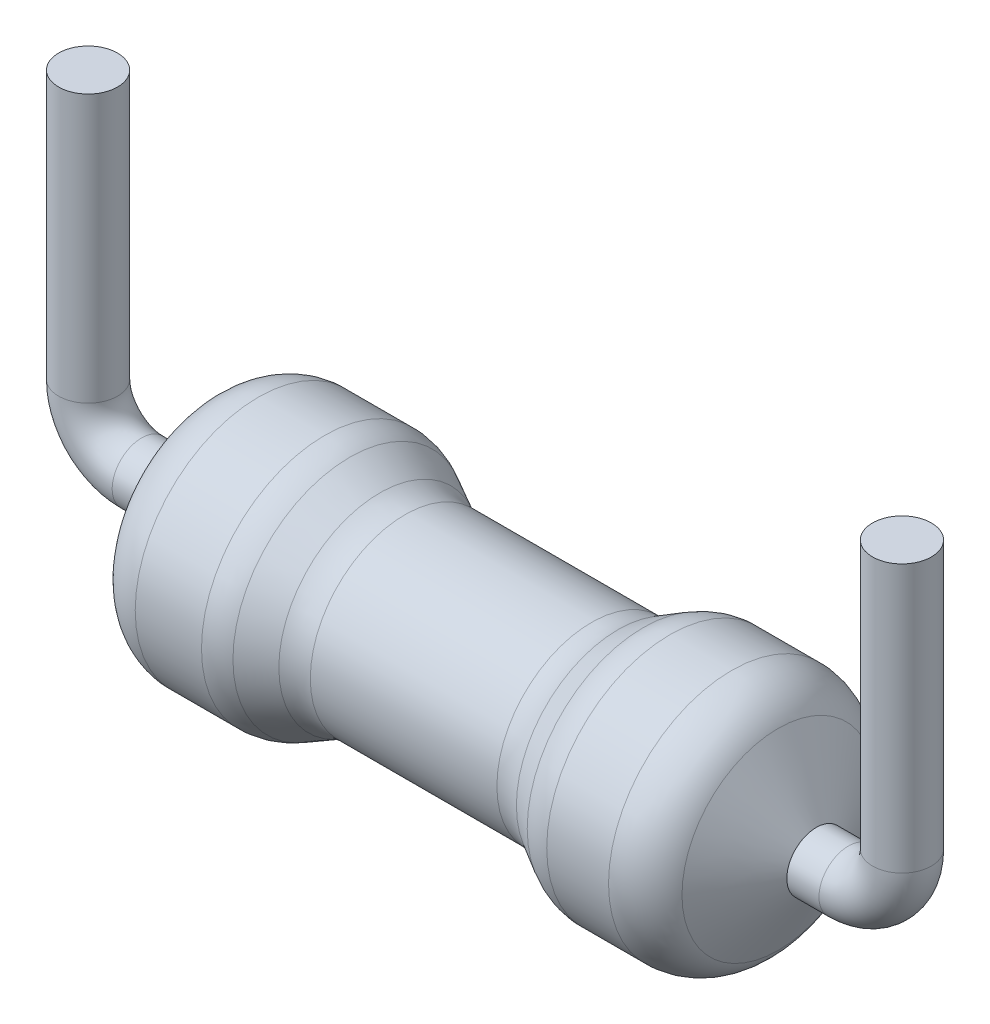
ISO-10303-21;
HEADER;
FILE_DESCRIPTION(('STEP AP214'),'2;1');
FILE_NAME('part.step','',(''),(''),'','','');
FILE_SCHEMA(('AUTOMOTIVE_DESIGN { 1 0 10303 214 1 1 1 1 }'));
ENDSEC;
DATA;
#1=APPLICATION_CONTEXT('core data for automotive mechanical design processes');
#2=APPLICATION_PROTOCOL_DEFINITION('international standard','automotive_design',2000,#1);
#3=PRODUCT_CONTEXT('',#1,'mechanical');
#4=PRODUCT('Part','Part','',(#3));
#5=PRODUCT_RELATED_PRODUCT_CATEGORY('part','',(#4));
#6=PRODUCT_DEFINITION_FORMATION('','',#4);
#7=PRODUCT_DEFINITION_CONTEXT('part definition',#1,'design');
#8=PRODUCT_DEFINITION('design','',#6,#7);
#9=PRODUCT_DEFINITION_SHAPE('','',#8);
#10=(LENGTH_UNIT() NAMED_UNIT(*) SI_UNIT(.MILLI.,.METRE.));
#11=(NAMED_UNIT(*) PLANE_ANGLE_UNIT() SI_UNIT($,.RADIAN.));
#12=(NAMED_UNIT(*) SI_UNIT($,.STERADIAN.) SOLID_ANGLE_UNIT());
#13=UNCERTAINTY_MEASURE_WITH_UNIT(LENGTH_MEASURE(1.E-05),#10,'distance_accuracy_value','');
#14=(GEOMETRIC_REPRESENTATION_CONTEXT(3) GLOBAL_UNCERTAINTY_ASSIGNED_CONTEXT((#13)) GLOBAL_UNIT_ASSIGNED_CONTEXT((#10,
#11,#12)) REPRESENTATION_CONTEXT('',''));
#15=CARTESIAN_POINT('',(0.,0.,0.));
#16=DIRECTION('',(0.,0.,1.));
#17=DIRECTION('',(1.,0.,0.));
#18=AXIS2_PLACEMENT_3D('',#15,#16,#17);
#19=CARTESIAN_POINT('',(3.,0.,0.));
#20=DIRECTION('',(-1.,0.,0.));
#21=DIRECTION('',(0.,0.,1.));
#22=AXIS2_PLACEMENT_3D('',#19,#20,#21);
#23=CONICAL_SURFACE('',#22,0.275,1.05165021254837);
#24=CARTESIAN_POINT('',(2.64396030332662,0.,0.));
#25=DIRECTION('',(1.,0.,0.));
#26=DIRECTION('',(0.,0.,-1.));
#27=AXIS2_PLACEMENT_3D('',#24,#25,#26);
#28=CIRCLE('',#27,0.898069469178417);
#29=CARTESIAN_POINT('',(2.64396030332662,0.,0.898069469178417));
#30=VERTEX_POINT('',#29);
#31=EDGE_CURVE('E11',#30,#30,#28,.T.);
#32=CARTESIAN_POINT('',(3.,0.,0.));
#33=DIRECTION('',(-1.,0.,0.));
#34=DIRECTION('',(0.,0.,1.));
#35=AXIS2_PLACEMENT_3D('',#32,#33,#34);
#36=CIRCLE('',#35,0.275);
#37=CARTESIAN_POINT('',(3.,0.,0.275));
#38=VERTEX_POINT('',#37);
#39=EDGE_CURVE('E61',#38,#38,#36,.T.);
#40=CARTESIAN_POINT('',(2.64396030332662,0.,0.898069469178417));
#41=CARTESIAN_POINT('',(2.64766905016697,0.,0.891579162207808));
#42=CARTESIAN_POINT('',(2.65137779700731,0.,0.8850888552372));
#43=CARTESIAN_POINT('',(2.65879529068801,0.,0.872108241295983));
#44=CARTESIAN_POINT('',(2.66250403752836,0.,0.865617934325374));
#45=CARTESIAN_POINT('',(2.66992153120905,0.,0.852637320384157));
#46=CARTESIAN_POINT('',(2.6736302780494,0.,0.846147013413549));
#47=CARTESIAN_POINT('',(2.6810477717301,0.,0.833166399472332));
#48=CARTESIAN_POINT('',(2.68475651857044,0.,0.826676092501723));
#49=CARTESIAN_POINT('',(2.69217401225114,0.,0.813695478560506));
#50=CARTESIAN_POINT('',(2.69588275909149,0.,0.807205171589898));
#51=CARTESIAN_POINT('',(2.70330025277218,0.,0.794224557648681));
#52=CARTESIAN_POINT('',(2.70700899961253,0.,0.787734250678072));
#53=CARTESIAN_POINT('',(2.71442649329323,0.,0.774753636736855));
#54=CARTESIAN_POINT('',(2.71813524013357,0.,0.768263329766247));
#55=CARTESIAN_POINT('',(2.72555273381427,0.,0.75528271582503));
#56=CARTESIAN_POINT('',(2.72926148065462,0.,0.748792408854421));
#57=CARTESIAN_POINT('',(2.73667897433531,0.,0.735811794913204));
#58=CARTESIAN_POINT('',(2.74038772117566,0.,0.729321487942596));
#59=CARTESIAN_POINT('',(2.74780521485635,0.,0.716340874001378));
#60=CARTESIAN_POINT('',(2.7515139616967,0.,0.70985056703077));
#61=CARTESIAN_POINT('',(2.7589314553774,0.,0.696869953089553));
#62=CARTESIAN_POINT('',(2.76264020221775,0.,0.690379646118944));
#63=CARTESIAN_POINT('',(2.77005769589844,0.,0.677399032177727));
#64=CARTESIAN_POINT('',(2.77376644273879,0.,0.670908725207119));
#65=CARTESIAN_POINT('',(2.78118393641948,0.,0.657928111265902));
#66=CARTESIAN_POINT('',(2.78489268325983,0.,0.651437804295293));
#67=CARTESIAN_POINT('',(2.79231017694053,0.,0.638457190354076));
#68=CARTESIAN_POINT('',(2.79601892378088,0.,0.631966883383468));
#69=CARTESIAN_POINT('',(2.80343641746157,0.,0.618986269442251));
#70=CARTESIAN_POINT('',(2.80714516430192,0.,0.612495962471642));
#71=CARTESIAN_POINT('',(2.81456265798261,0.,0.599515348530425));
#72=CARTESIAN_POINT('',(2.81827140482296,0.,0.593025041559817));
#73=CARTESIAN_POINT('',(2.82568889850366,0.,0.5800444276186));
#74=CARTESIAN_POINT('',(2.82939764534401,0.,0.573554120647991));
#75=CARTESIAN_POINT('',(2.8368151390247,0.,0.560573506706774));
#76=CARTESIAN_POINT('',(2.84052388586505,0.,0.554083199736166));
#77=CARTESIAN_POINT('',(2.84794137954574,0.,0.541102585794949));
#78=CARTESIAN_POINT('',(2.85165012638609,0.,0.53461227882434));
#79=CARTESIAN_POINT('',(2.85906762006679,0.,0.521631664883123));
#80=CARTESIAN_POINT('',(2.86277636690713,0.,0.515141357912515));
#81=CARTESIAN_POINT('',(2.87019386058783,0.,0.502160743971298));
#82=CARTESIAN_POINT('',(2.87390260742818,0.,0.495670437000689));
#83=CARTESIAN_POINT('',(2.88132010110887,0.,0.482689823059472));
#84=CARTESIAN_POINT('',(2.88502884794922,0.,0.476199516088863));
#85=CARTESIAN_POINT('',(2.89244634162992,0.,0.463218902147646));
#86=CARTESIAN_POINT('',(2.89615508847026,0.,0.456728595177038));
#87=CARTESIAN_POINT('',(2.90357258215096,0.,0.443747981235821));
#88=CARTESIAN_POINT('',(2.90728132899131,0.,0.437257674265212));
#89=CARTESIAN_POINT('',(2.914698822672,0.,0.424277060323995));
#90=CARTESIAN_POINT('',(2.91840756951235,0.,0.417786753353387));
#91=CARTESIAN_POINT('',(2.92582506319305,0.,0.40480613941217));
#92=CARTESIAN_POINT('',(2.92953381003339,0.,0.398315832441561));
#93=CARTESIAN_POINT('',(2.93695130371409,0.,0.385335218500344));
#94=CARTESIAN_POINT('',(2.94066005055444,0.,0.378844911529736));
#95=CARTESIAN_POINT('',(2.94807754423513,0.,0.365864297588519));
#96=CARTESIAN_POINT('',(2.95178629107548,0.,0.35937399061791));
#97=CARTESIAN_POINT('',(2.95920378475618,0.,0.346393376676693));
#98=CARTESIAN_POINT('',(2.96291253159652,0.,0.339903069706085));
#99=CARTESIAN_POINT('',(2.97033002527722,0.,0.326922455764868));
#100=CARTESIAN_POINT('',(2.97403877211757,0.,0.320432148794259));
#101=CARTESIAN_POINT('',(2.98145626579826,0.,0.307451534853042));
#102=CARTESIAN_POINT('',(2.98516501263861,0.,0.300961227882434));
#103=CARTESIAN_POINT('',(2.9925825063193,0.,0.287980613941217));
#104=CARTESIAN_POINT('',(2.99629125315965,0.,0.281490306970608));
#105=CARTESIAN_POINT('',(3.,0.,0.275));
#106=B_SPLINE_CURVE_WITH_KNOTS('',3,(#40,#41,#42,#43,#44,#45,#46,#47,#48,#49,#50,#51,#52,#53,
#54,#55,#56,#57,#58,#59,#60,#61,#62,#63,#64,#65,#66,#67,#68,#69,#70,#71,#72,#73,#74,#75,#76,#77,
#78,#79,#80,#81,#82,#83,#84,#85,#86,#87,#88,#89,#90,#91,#92,#93,#94,#95,#96,#97,#98,#99,#100,
#101,#102,#103,#104,#105),.UNSPECIFIED.,.F.,.F.,(4,2,2,2,2,2,2,2,2,2,2,2,2,2,2,2,2,2,2,2,2,2,2,
2,2,2,2,2,2,2,2,2,4),(0.,0.0224256547125532,0.0448513094251064,0.0672769641376601,
0.0897026188502135,0.112128273562767,0.13455392827532,0.156979582987874,0.179405237700427,
0.20183089241298,0.224256547125534,0.246682201838087,0.269107856550641,0.291533511263194,
0.313959165975747,0.336384820688301,0.358810475400854,0.381236130113408,0.403661784825961,
0.426087439538515,0.448513094251068,0.470938748963621,0.493364403676175,0.515790058388728,
0.538215713101281,0.560641367813835,0.583067022526388,0.605492677238942,0.627918331951495,
0.650343986664048,0.672769641376602,0.695195296089155,0.717620950801708),.UNSPECIFIED.);
#107=EDGE_CURVE('BSEAM39',#30,#38,#106,.T.);
#108=ORIENTED_EDGE('',*,*,#31,.T.);
#109=ORIENTED_EDGE('',*,*,#39,.T.);
#110=ORIENTED_EDGE('',*,*,#107,.T.);
#111=ORIENTED_EDGE('',*,*,#107,.F.);
#112=EDGE_LOOP('',(#108,#110,#109,#111));
#113=FACE_BOUND('',#112,.T.);
#114=ADVANCED_FACE('F39',(#113),#23,.T.);
#115=CARTESIAN_POINT('',(0.,0.,0.));
#116=DIRECTION('',(-1.,0.,0.));
#117=DIRECTION('',(0.,0.,1.));
#118=AXIS2_PLACEMENT_3D('',#115,#116,#117);
#119=CYLINDRICAL_SURFACE('',#118,1.15);
#120=CARTESIAN_POINT('',(1.63278221853732,0.,0.));
#121=DIRECTION('',(1.,0.,0.));
#122=DIRECTION('',(0.,0.,-1.));
#123=AXIS2_PLACEMENT_3D('',#120,#121,#122);
#124=CIRCLE('',#123,1.15);
#125=CARTESIAN_POINT('',(1.63278221853732,0.,-1.15));
#126=VERTEX_POINT('',#125);
#127=EDGE_CURVE('E48',#126,#126,#124,.T.);
#128=ORIENTED_EDGE('',*,*,#127,.T.);
#129=EDGE_LOOP('',(#128));
#130=FACE_BOUND('',#129,.T.);
#131=CARTESIAN_POINT('',(2.20983873226439,0.,0.));
#132=DIRECTION('',(1.,0.,0.));
#133=DIRECTION('',(0.,0.,-1.));
#134=AXIS2_PLACEMENT_3D('',#131,#132,#133);
#135=CIRCLE('',#134,1.15);
#136=CARTESIAN_POINT('',(2.20983873226439,0.,-1.15));
#137=VERTEX_POINT('',#136);
#138=EDGE_CURVE('E113',#137,#137,#135,.F.);
#139=ORIENTED_EDGE('',*,*,#138,.T.);
#140=EDGE_LOOP('',(#139));
#141=FACE_BOUND('',#140,.T.);
#142=ADVANCED_FACE('F120',(#130,#141),#119,.T.);
#143=CARTESIAN_POINT('',(1.5,0.,0.));
#144=DIRECTION('',(1.,0.,0.));
#145=DIRECTION('',(0.,0.,-1.));
#146=AXIS2_PLACEMENT_3D('',#143,#144,#145);
#147=CONICAL_SURFACE('',#146,1.15,0.519146114246524);
#148=CARTESIAN_POINT('',(1.14909833092873,0.,0.));
#149=DIRECTION('',(1.,0.,0.));
#150=DIRECTION('',(0.,0.,-1.));
#151=AXIS2_PLACEMENT_3D('',#148,#149,#150);
#152=CIRCLE('',#151,0.949484760530703);
#153=CARTESIAN_POINT('',(1.14909833092873,0.,-0.949484760530703));
#154=VERTEX_POINT('',#153);
#155=EDGE_CURVE('E109',#154,#154,#152,.T.);
#156=ORIENTED_EDGE('',*,*,#155,.T.);
#157=EDGE_LOOP('',(#156));
#158=FACE_BOUND('',#157,.T.);
#159=CARTESIAN_POINT('',(1.3847127493589,0.,0.));
#160=DIRECTION('',(-1.,0.,0.));
#161=DIRECTION('',(0.,0.,1.));
#162=AXIS2_PLACEMENT_3D('',#159,#160,#161);
#163=CIRCLE('',#162,1.08412157106223);
#164=CARTESIAN_POINT('',(1.3847127493589,0.,1.08412157106223));
#165=VERTEX_POINT('',#164);
#166=EDGE_CURVE('E105',#165,#165,#163,.T.);
#167=ORIENTED_EDGE('',*,*,#166,.T.);
#168=EDGE_LOOP('',(#167));
#169=FACE_BOUND('',#168,.T.);
#170=ADVANCED_FACE('F129',(#158,#169),#147,.T.);
#171=CARTESIAN_POINT('',(0.,0.,0.));
#172=DIRECTION('',(-1.,0.,0.));
#173=DIRECTION('',(0.,0.,1.));
#174=AXIS2_PLACEMENT_3D('',#171,#172,#173);
#175=CYLINDRICAL_SURFACE('',#174,0.883606331592932);
#176=CARTESIAN_POINT('',(-0.841301852192726,0.,0.));
#177=DIRECTION('',(-1.,0.,0.));
#178=DIRECTION('',(0.,0.,1.));
#179=AXIS2_PLACEMENT_3D('',#176,#177,#178);
#180=CIRCLE('',#179,0.883606331592932);
#181=CARTESIAN_POINT('',(-0.841301852192726,0.,0.883606331592932));
#182=VERTEX_POINT('',#181);
#183=EDGE_CURVE('E101',#182,#182,#180,.F.);
#184=ORIENTED_EDGE('',*,*,#183,.T.);
#185=EDGE_LOOP('',(#184));
#186=FACE_BOUND('',#185,.T.);
#187=CARTESIAN_POINT('',(0.901028861750313,0.,0.));
#188=DIRECTION('',(-1.,0.,0.));
#189=DIRECTION('',(0.,0.,1.));
#190=AXIS2_PLACEMENT_3D('',#187,#188,#189);
#191=CIRCLE('',#190,0.883606331592932);
#192=CARTESIAN_POINT('',(0.901028861750313,0.,0.883606331592932));
#193=VERTEX_POINT('',#192);
#194=EDGE_CURVE('E97',#193,#193,#191,.T.);
#195=ORIENTED_EDGE('',*,*,#194,.T.);
#196=EDGE_LOOP('',(#195));
#197=FACE_BOUND('',#196,.T.);
#198=ADVANCED_FACE('F131',(#186,#197),#175,.T.);
#199=CARTESIAN_POINT('',(-0.966188919712368,0.,0.));
#200=DIRECTION('',(-1.,0.,0.));
#201=DIRECTION('',(0.,0.,1.));
#202=AXIS2_PLACEMENT_3D('',#199,#200,#201);
#203=CONICAL_SURFACE('',#202,0.883606331592932,0.489532146090949);
#204=CARTESIAN_POINT('',(-1.3559694703309,0.,0.));
#205=DIRECTION('',(1.,0.,0.));
#206=DIRECTION('',(0.,0.,-1.));
#207=AXIS2_PLACEMENT_3D('',#204,#205,#206);
#208=CIRCLE('',#207,1.09127647309893);
#209=CARTESIAN_POINT('',(-1.3559694703309,0.,-1.09127647309893));
#210=VERTEX_POINT('',#209);
#211=EDGE_CURVE('E93',#210,#210,#208,.T.);
#212=ORIENTED_EDGE('',*,*,#211,.T.);
#213=EDGE_LOOP('',(#212));
#214=FACE_BOUND('',#213,.T.);
#215=CARTESIAN_POINT('',(-1.07640836909384,0.,0.));
#216=DIRECTION('',(-1.,0.,0.));
#217=DIRECTION('',(0.,0.,1.));
#218=AXIS2_PLACEMENT_3D('',#215,#216,#217);
#219=CIRCLE('',#218,0.942329858494006);
#220=CARTESIAN_POINT('',(-1.07640836909384,0.,0.942329858494006));
#221=VERTEX_POINT('',#220);
#222=EDGE_CURVE('E89',#221,#221,#219,.T.);
#223=ORIENTED_EDGE('',*,*,#222,.T.);
#224=EDGE_LOOP('',(#223));
#225=FACE_BOUND('',#224,.T.);
#226=ADVANCED_FACE('F138',(#214,#225),#203,.T.);
#227=CARTESIAN_POINT('',(0.,0.,0.));
#228=DIRECTION('',(-1.,0.,0.));
#229=DIRECTION('',(0.,0.,1.));
#230=AXIS2_PLACEMENT_3D('',#227,#228,#229);
#231=CYLINDRICAL_SURFACE('',#230,1.15);
#232=CARTESIAN_POINT('',(-2.20983873226439,0.,0.));
#233=DIRECTION('',(1.,0.,0.));
#234=DIRECTION('',(0.,0.,-1.));
#235=AXIS2_PLACEMENT_3D('',#232,#233,#234);
#236=CIRCLE('',#235,1.15);
#237=CARTESIAN_POINT('',(-2.20983873226439,0.,-1.15));
#238=VERTEX_POINT('',#237);
#239=EDGE_CURVE('E85',#238,#238,#236,.T.);
#240=ORIENTED_EDGE('',*,*,#239,.T.);
#241=EDGE_LOOP('',(#240));
#242=FACE_BOUND('',#241,.T.);
#243=CARTESIAN_POINT('',(-1.59107598723201,0.,0.));
#244=DIRECTION('',(1.,0.,0.));
#245=DIRECTION('',(0.,0.,-1.));
#246=AXIS2_PLACEMENT_3D('',#243,#244,#245);
#247=CIRCLE('',#246,1.15);
#248=CARTESIAN_POINT('',(-1.59107598723201,0.,-1.15));
#249=VERTEX_POINT('',#248);
#250=EDGE_CURVE('E81',#249,#249,#247,.F.);
#251=ORIENTED_EDGE('',*,*,#250,.T.);
#252=EDGE_LOOP('',(#251));
#253=FACE_BOUND('',#252,.T.);
#254=ADVANCED_FACE('F285',(#242,#253),#231,.T.);
#255=CARTESIAN_POINT('',(-2.5,0.,0.));
#256=DIRECTION('',(1.,0.,0.));
#257=DIRECTION('',(0.,0.,-1.));
#258=AXIS2_PLACEMENT_3D('',#255,#256,#257);
#259=CONICAL_SURFACE('',#258,1.15,1.05165021254837);
#260=CARTESIAN_POINT('',(-2.64396030332662,0.,0.));
#261=DIRECTION('',(-1.,0.,0.));
#262=DIRECTION('',(0.,0.,1.));
#263=AXIS2_PLACEMENT_3D('',#260,#261,#262);
#264=CIRCLE('',#263,0.898069469178417);
#265=CARTESIAN_POINT('',(-2.64396030332662,0.,-0.898069469178417));
#266=VERTEX_POINT('',#265);
#267=EDGE_CURVE('E77',#266,#266,#264,.T.);
#268=CARTESIAN_POINT('',(-3.,0.,0.));
#269=DIRECTION('',(-1.,0.,0.));
#270=DIRECTION('',(0.,0.,1.));
#271=AXIS2_PLACEMENT_3D('',#268,#269,#270);
#272=CIRCLE('',#271,0.274999999999999);
#273=CARTESIAN_POINT('',(-3.,0.,-0.274999999999999));
#274=VERTEX_POINT('',#273);
#275=EDGE_CURVE('E67',#274,#274,#272,.T.);
#276=CARTESIAN_POINT('',(-2.64396030332662,0.,-0.898069469178417));
#277=CARTESIAN_POINT('',(-2.64766905016697,0.,-0.891579162207809));
#278=CARTESIAN_POINT('',(-2.65137779700731,0.,-0.8850888552372));
#279=CARTESIAN_POINT('',(-2.65879529068801,0.,-0.872108241295983));
#280=CARTESIAN_POINT('',(-2.66250403752836,0.,-0.865617934325375));
#281=CARTESIAN_POINT('',(-2.66992153120905,0.,-0.852637320384158));
#282=CARTESIAN_POINT('',(-2.6736302780494,0.,-0.846147013413549));
#283=CARTESIAN_POINT('',(-2.6810477717301,0.,-0.833166399472332));
#284=CARTESIAN_POINT('',(-2.68475651857044,0.,-0.826676092501724));
#285=CARTESIAN_POINT('',(-2.69217401225114,0.,-0.813695478560507));
#286=CARTESIAN_POINT('',(-2.69588275909149,0.,-0.807205171589898));
#287=CARTESIAN_POINT('',(-2.70330025277218,0.,-0.794224557648681));
#288=CARTESIAN_POINT('',(-2.70700899961253,0.,-0.787734250678072));
#289=CARTESIAN_POINT('',(-2.71442649329322,0.,-0.774753636736855));
#290=CARTESIAN_POINT('',(-2.71813524013357,0.,-0.768263329766247));
#291=CARTESIAN_POINT('',(-2.72555273381427,0.,-0.75528271582503));
#292=CARTESIAN_POINT('',(-2.72926148065462,0.,-0.748792408854421));
#293=CARTESIAN_POINT('',(-2.73667897433531,0.,-0.735811794913204));
#294=CARTESIAN_POINT('',(-2.74038772117566,0.,-0.729321487942596));
#295=CARTESIAN_POINT('',(-2.74780521485635,0.,-0.716340874001379));
#296=CARTESIAN_POINT('',(-2.7515139616967,0.,-0.70985056703077));
#297=CARTESIAN_POINT('',(-2.7589314553774,0.,-0.696869953089553));
#298=CARTESIAN_POINT('',(-2.76264020221775,0.,-0.690379646118944));
#299=CARTESIAN_POINT('',(-2.77005769589844,0.,-0.677399032177727));
#300=CARTESIAN_POINT('',(-2.77376644273879,0.,-0.670908725207119));
#301=CARTESIAN_POINT('',(-2.78118393641948,0.,-0.657928111265902));
#302=CARTESIAN_POINT('',(-2.78489268325983,0.,-0.651437804295294));
#303=CARTESIAN_POINT('',(-2.79231017694053,0.,-0.638457190354076));
#304=CARTESIAN_POINT('',(-2.79601892378088,0.,-0.631966883383468));
#305=CARTESIAN_POINT('',(-2.80343641746157,0.,-0.618986269442251));
#306=CARTESIAN_POINT('',(-2.80714516430192,0.,-0.612495962471642));
#307=CARTESIAN_POINT('',(-2.81456265798261,0.,-0.599515348530425));
#308=CARTESIAN_POINT('',(-2.81827140482296,0.,-0.593025041559817));
#309=CARTESIAN_POINT('',(-2.82568889850366,0.,-0.5800444276186));
#310=CARTESIAN_POINT('',(-2.829397645344,0.,-0.573554120647991));
#311=CARTESIAN_POINT('',(-2.8368151390247,0.,-0.560573506706774));
#312=CARTESIAN_POINT('',(-2.84052388586505,0.,-0.554083199736166));
#313=CARTESIAN_POINT('',(-2.84794137954574,0.,-0.541102585794949));
#314=CARTESIAN_POINT('',(-2.85165012638609,0.,-0.53461227882434));
#315=CARTESIAN_POINT('',(-2.85906762006679,0.,-0.521631664883123));
#316=CARTESIAN_POINT('',(-2.86277636690713,0.,-0.515141357912514));
#317=CARTESIAN_POINT('',(-2.87019386058783,0.,-0.502160743971297));
#318=CARTESIAN_POINT('',(-2.87390260742818,0.,-0.495670437000689));
#319=CARTESIAN_POINT('',(-2.88132010110887,0.,-0.482689823059472));
#320=CARTESIAN_POINT('',(-2.88502884794922,0.,-0.476199516088863));
#321=CARTESIAN_POINT('',(-2.89244634162992,0.,-0.463218902147646));
#322=CARTESIAN_POINT('',(-2.89615508847026,0.,-0.456728595177038));
#323=CARTESIAN_POINT('',(-2.90357258215096,0.,-0.443747981235821));
#324=CARTESIAN_POINT('',(-2.90728132899131,0.,-0.437257674265212));
#325=CARTESIAN_POINT('',(-2.914698822672,0.,-0.424277060323995));
#326=CARTESIAN_POINT('',(-2.91840756951235,0.,-0.417786753353386));
#327=CARTESIAN_POINT('',(-2.92582506319305,0.,-0.404806139412169));
#328=CARTESIAN_POINT('',(-2.92953381003339,0.,-0.398315832441561));
#329=CARTESIAN_POINT('',(-2.93695130371409,0.,-0.385335218500344));
#330=CARTESIAN_POINT('',(-2.94066005055444,0.,-0.378844911529735));
#331=CARTESIAN_POINT('',(-2.94807754423513,0.,-0.365864297588518));
#332=CARTESIAN_POINT('',(-2.95178629107548,0.,-0.35937399061791));
#333=CARTESIAN_POINT('',(-2.95920378475618,0.,-0.346393376676693));
#334=CARTESIAN_POINT('',(-2.96291253159652,0.,-0.339903069706084));
#335=CARTESIAN_POINT('',(-2.97033002527722,0.,-0.326922455764867));
#336=CARTESIAN_POINT('',(-2.97403877211757,0.,-0.320432148794259));
#337=CARTESIAN_POINT('',(-2.98145626579826,0.,-0.307451534853042));
#338=CARTESIAN_POINT('',(-2.98516501263861,0.,-0.300961227882433));
#339=CARTESIAN_POINT('',(-2.9925825063193,0.,-0.287980613941216));
#340=CARTESIAN_POINT('',(-2.99629125315965,0.,-0.281490306970608));
#341=CARTESIAN_POINT('',(-3.,0.,-0.274999999999999));
#342=B_SPLINE_CURVE_WITH_KNOTS('',3,(#276,#277,#278,#279,#280,#281,#282,#283,#284,#285,#286,
#287,#288,#289,#290,#291,#292,#293,#294,#295,#296,#297,#298,#299,#300,#301,#302,#303,#304,#305,
#306,#307,#308,#309,#310,#311,#312,#313,#314,#315,#316,#317,#318,#319,#320,#321,#322,#323,#324,
#325,#326,#327,#328,#329,#330,#331,#332,#333,#334,#335,#336,#337,#338,#339,#340,#341),
.UNSPECIFIED.,.F.,.F.,(4,2,2,2,2,2,2,2,2,2,2,2,2,2,2,2,2,2,2,2,2,2,2,2,2,2,2,2,2,2,2,2,4),(0.,
0.0224256547125532,0.0448513094251066,0.0672769641376601,0.0897026188502136,0.112128273562767,
0.13455392827532,0.156979582987874,0.179405237700427,0.201830892412981,0.224256547125534,
0.246682201838088,0.269107856550641,0.291533511263194,0.313959165975748,0.336384820688301,
0.358810475400855,0.381236130113408,0.403661784825961,0.426087439538515,0.448513094251068,
0.470938748963622,0.493364403676175,0.515790058388729,0.538215713101282,0.560641367813836,
0.583067022526389,0.605492677238942,0.627918331951496,0.650343986664049,0.672769641376603,
0.695195296089156,0.71762095080171),.UNSPECIFIED.);
#343=EDGE_CURVE('BSEAM153',#266,#274,#342,.T.);
#344=ORIENTED_EDGE('',*,*,#267,.T.);
#345=ORIENTED_EDGE('',*,*,#275,.F.);
#346=ORIENTED_EDGE('',*,*,#343,.T.);
#347=ORIENTED_EDGE('',*,*,#343,.F.);
#348=EDGE_LOOP('',(#344,#346,#345,#347));
#349=FACE_BOUND('',#348,.T.);
#350=ADVANCED_FACE('F153',(#349),#259,.T.);
#351=CARTESIAN_POINT('',(-2.20983873226439,0.,0.));
#352=DIRECTION('',(1.,0.,0.));
#353=DIRECTION('',(0.,0.,-1.));
#354=AXIS2_PLACEMENT_3D('',#351,#352,#353);
#355=TOROIDAL_SURFACE('',#354,0.65,0.5);
#356=ORIENTED_EDGE('',*,*,#239,.F.);
#357=EDGE_LOOP('',(#356));
#358=FACE_BOUND('',#357,.T.);
#359=ORIENTED_EDGE('',*,*,#267,.F.);
#360=EDGE_LOOP('',(#359));
#361=FACE_BOUND('',#360,.T.);
#362=ADVANCED_FACE('F149',(#358,#361),#355,.T.);
#363=CARTESIAN_POINT('',(-1.59107598723201,0.,0.));
#364=DIRECTION('',(1.,0.,0.));
#365=DIRECTION('',(0.,0.,-1.));
#366=AXIS2_PLACEMENT_3D('',#363,#364,#365);
#367=TOROIDAL_SURFACE('',#366,0.65,0.5);
#368=ORIENTED_EDGE('',*,*,#211,.F.);
#369=EDGE_LOOP('',(#368));
#370=FACE_BOUND('',#369,.T.);
#371=ORIENTED_EDGE('',*,*,#250,.F.);
#372=EDGE_LOOP('',(#371));
#373=FACE_BOUND('',#372,.T.);
#374=ADVANCED_FACE('F152',(#370,#373),#367,.T.);
#375=CARTESIAN_POINT('',(-0.841301852192726,0.,0.));
#376=DIRECTION('',(-1.,0.,0.));
#377=DIRECTION('',(0.,0.,1.));
#378=AXIS2_PLACEMENT_3D('',#375,#376,#377);
#379=TOROIDAL_SURFACE('',#378,1.38360633159293,0.5);
#380=ORIENTED_EDGE('',*,*,#183,.F.);
#381=EDGE_LOOP('',(#380));
#382=FACE_BOUND('',#381,.T.);
#383=ORIENTED_EDGE('',*,*,#222,.F.);
#384=EDGE_LOOP('',(#383));
#385=FACE_BOUND('',#384,.T.);
#386=ADVANCED_FACE('F157',(#382,#385),#379,.F.);
#387=CARTESIAN_POINT('',(0.901028861750313,0.,0.));
#388=DIRECTION('',(-1.,0.,0.));
#389=DIRECTION('',(0.,0.,1.));
#390=AXIS2_PLACEMENT_3D('',#387,#388,#389);
#391=TOROIDAL_SURFACE('',#390,1.38360633159293,0.5);
#392=ORIENTED_EDGE('',*,*,#155,.F.);
#393=EDGE_LOOP('',(#392));
#394=FACE_BOUND('',#393,.T.);
#395=ORIENTED_EDGE('',*,*,#194,.F.);
#396=EDGE_LOOP('',(#395));
#397=FACE_BOUND('',#396,.T.);
#398=ADVANCED_FACE('F126',(#394,#397),#391,.F.);
#399=CARTESIAN_POINT('',(1.63278221853732,0.,0.));
#400=DIRECTION('',(1.,0.,0.));
#401=DIRECTION('',(0.,0.,-1.));
#402=AXIS2_PLACEMENT_3D('',#399,#400,#401);
#403=TOROIDAL_SURFACE('',#402,0.65,0.5);
#404=ORIENTED_EDGE('',*,*,#127,.F.);
#405=EDGE_LOOP('',(#404));
#406=FACE_BOUND('',#405,.T.);
#407=ORIENTED_EDGE('',*,*,#166,.F.);
#408=EDGE_LOOP('',(#407));
#409=FACE_BOUND('',#408,.T.);
#410=ADVANCED_FACE('F123',(#406,#409),#403,.T.);
#411=CARTESIAN_POINT('',(2.20983873226439,0.,0.));
#412=DIRECTION('',(1.,0.,0.));
#413=DIRECTION('',(0.,0.,-1.));
#414=AXIS2_PLACEMENT_3D('',#411,#412,#413);
#415=TOROIDAL_SURFACE('',#414,0.65,0.5);
#416=ORIENTED_EDGE('',*,*,#31,.F.);
#417=EDGE_LOOP('',(#416));
#418=FACE_BOUND('',#417,.T.);
#419=ORIENTED_EDGE('',*,*,#138,.F.);
#420=EDGE_LOOP('',(#419));
#421=FACE_BOUND('',#420,.T.);
#422=ADVANCED_FACE('F41',(#418,#421),#415,.T.);
#423=CARTESIAN_POINT('',(-3.8,3.,0.));
#424=DIRECTION('',(0.,-1.,0.));
#425=DIRECTION('',(0.,0.,-1.));
#426=AXIS2_PLACEMENT_3D('',#423,#424,#425);
#427=PLANE('',#426);
#428=CARTESIAN_POINT('',(-3.8,3.,0.));
#429=DIRECTION('',(0.,-1.,0.));
#430=DIRECTION('',(0.,0.,-1.));
#431=AXIS2_PLACEMENT_3D('',#428,#429,#430);
#432=CIRCLE('',#431,0.275);
#433=CARTESIAN_POINT('',(-3.8,3.,-0.275));
#434=VERTEX_POINT('',#433);
#435=EDGE_CURVE('E53',#434,#434,#432,.T.);
#436=ORIENTED_EDGE('',*,*,#435,.F.);
#437=EDGE_LOOP('',(#436));
#438=FACE_BOUND('',#437,.T.);
#439=ADVANCED_FACE('F182',(#438),#427,.F.);
#440=CARTESIAN_POINT('',(-3.8,3.,0.));
#441=DIRECTION('',(0.,-1.,0.));
#442=DIRECTION('',(0.,0.,-1.));
#443=AXIS2_PLACEMENT_3D('',#440,#441,#442);
#444=CYLINDRICAL_SURFACE('',#443,0.275);
#445=CARTESIAN_POINT('',(-3.8,0.499999999999999,0.));
#446=DIRECTION('',(0.,-1.,0.));
#447=DIRECTION('',(0.,0.,-1.));
#448=AXIS2_PLACEMENT_3D('',#445,#446,#447);
#449=CIRCLE('',#448,0.275);
#450=CARTESIAN_POINT('',(-4.075,0.499999999999999,0.));
#451=VERTEX_POINT('',#450);
#452=EDGE_CURVE('E351',#451,#451,#449,.T.);
#453=ORIENTED_EDGE('',*,*,#452,.F.);
#454=EDGE_LOOP('',(#453));
#455=FACE_BOUND('',#454,.T.);
#456=ORIENTED_EDGE('',*,*,#435,.T.);
#457=EDGE_LOOP('',(#456));
#458=FACE_BOUND('',#457,.T.);
#459=ADVANCED_FACE('F189',(#455,#458),#444,.T.);
#460=CARTESIAN_POINT('',(-3.3,0.499999999999999,0.));
#461=DIRECTION('',(0.,0.,1.));
#462=DIRECTION('',(1.,0.,0.));
#463=AXIS2_PLACEMENT_3D('',#460,#461,#462);
#464=TOROIDAL_SURFACE('',#463,0.5,0.275);
#465=CARTESIAN_POINT('',(-3.3,0.,0.));
#466=DIRECTION('',(1.,0.,0.));
#467=DIRECTION('',(0.,0.,-1.));
#468=AXIS2_PLACEMENT_3D('',#465,#466,#467);
#469=CIRCLE('',#468,0.275);
#470=CARTESIAN_POINT('',(-3.3,-0.275,0.));
#471=VERTEX_POINT('',#470);
#472=EDGE_CURVE('E348',#471,#471,#469,.T.);
#473=CARTESIAN_POINT('',(-3.3,0.499999999999999,0.));
#474=DIRECTION('',(0.,0.,1.));
#475=DIRECTION('',(1.,0.,0.));
#476=AXIS2_PLACEMENT_3D('',#473,#474,#475);
#477=CIRCLE('',#476,0.775);
#478=EDGE_CURVE('',#451,#471,#477,.T.);
#479=ORIENTED_EDGE('',*,*,#452,.T.);
#480=ORIENTED_EDGE('',*,*,#472,.F.);
#481=ORIENTED_EDGE('',*,*,#478,.T.);
#482=ORIENTED_EDGE('',*,*,#478,.F.);
#483=EDGE_LOOP('',(#479,#481,#480,#482));
#484=FACE_BOUND('',#483,.T.);
#485=ADVANCED_FACE('F196',(#484),#464,.T.);
#486=CARTESIAN_POINT('',(-3.3,0.,0.));
#487=DIRECTION('',(1.,0.,0.));
#488=DIRECTION('',(0.,1.,0.));
#489=AXIS2_PLACEMENT_3D('',#486,#487,#488);
#490=CYLINDRICAL_SURFACE('',#489,0.275);
#491=ORIENTED_EDGE('',*,*,#472,.T.);
#492=EDGE_LOOP('',(#491));
#493=FACE_BOUND('',#492,.T.);
#494=ORIENTED_EDGE('',*,*,#275,.T.);
#495=EDGE_LOOP('',(#494));
#496=FACE_BOUND('',#495,.T.);
#497=ADVANCED_FACE('F204',(#493,#496),#490,.T.);
#498=CARTESIAN_POINT('',(3.3,0.,0.));
#499=DIRECTION('',(1.,0.,0.));
#500=DIRECTION('',(0.,0.,-1.));
#501=AXIS2_PLACEMENT_3D('',#498,#499,#500);
#502=CIRCLE('',#501,0.275);
#503=CARTESIAN_POINT('',(3.3,-0.275,0.));
#504=VERTEX_POINT('',#503);
#505=EDGE_CURVE('E70',#504,#504,#502,.T.);
#506=ORIENTED_EDGE('',*,*,#505,.F.);
#507=EDGE_LOOP('',(#506));
#508=FACE_BOUND('',#507,.T.);
#509=ORIENTED_EDGE('',*,*,#39,.F.);
#510=EDGE_LOOP('',(#509));
#511=FACE_BOUND('',#510,.T.);
#512=ADVANCED_FACE('F212',(#508,#511),#490,.T.);
#513=CARTESIAN_POINT('',(3.8,3.,0.));
#514=DIRECTION('',(0.,1.,0.));
#515=DIRECTION('',(0.,0.,-1.));
#516=AXIS2_PLACEMENT_3D('',#513,#514,#515);
#517=PLANE('',#516);
#518=CARTESIAN_POINT('',(3.8,3.,0.));
#519=DIRECTION('',(0.,1.,0.));
#520=DIRECTION('',(0.,0.,-1.));
#521=AXIS2_PLACEMENT_3D('',#518,#519,#520);
#522=CIRCLE('',#521,0.275);
#523=CARTESIAN_POINT('',(3.8,3.,-0.275));
#524=VERTEX_POINT('',#523);
#525=EDGE_CURVE('E57',#524,#524,#522,.T.);
#526=ORIENTED_EDGE('',*,*,#525,.T.);
#527=EDGE_LOOP('',(#526));
#528=FACE_BOUND('',#527,.T.);
#529=ADVANCED_FACE('F58',(#528),#517,.T.);
#530=CARTESIAN_POINT('',(3.3,0.5,0.));
#531=DIRECTION('',(0.,0.,1.));
#532=DIRECTION('',(1.,0.,0.));
#533=AXIS2_PLACEMENT_3D('',#530,#531,#532);
#534=TOROIDAL_SURFACE('',#533,0.5,0.275);
#535=CARTESIAN_POINT('',(3.8,0.5,0.));
#536=DIRECTION('',(0.,1.,0.));
#537=DIRECTION('',(0.,0.,-1.));
#538=AXIS2_PLACEMENT_3D('',#535,#536,#537);
#539=CIRCLE('',#538,0.275);
#540=CARTESIAN_POINT('',(4.075,0.5,0.));
#541=VERTEX_POINT('',#540);
#542=EDGE_CURVE('E62',#541,#541,#539,.T.);
#543=CARTESIAN_POINT('',(3.3,0.5,0.));
#544=DIRECTION('',(0.,0.,1.));
#545=DIRECTION('',(1.,0.,0.));
#546=AXIS2_PLACEMENT_3D('',#543,#544,#545);
#547=CIRCLE('',#546,0.775);
#548=EDGE_CURVE('',#504,#541,#547,.T.);
#549=ORIENTED_EDGE('',*,*,#505,.T.);
#550=ORIENTED_EDGE('',*,*,#542,.F.);
#551=ORIENTED_EDGE('',*,*,#548,.T.);
#552=ORIENTED_EDGE('',*,*,#548,.F.);
#553=EDGE_LOOP('',(#549,#551,#550,#552));
#554=FACE_BOUND('',#553,.T.);
#555=ADVANCED_FACE('F227',(#554),#534,.T.);
#556=CARTESIAN_POINT('',(3.8,0.5,0.));
#557=DIRECTION('',(0.,1.,0.));
#558=DIRECTION('',(0.,0.,1.));
#559=AXIS2_PLACEMENT_3D('',#556,#557,#558);
#560=CYLINDRICAL_SURFACE('',#559,0.275);
#561=ORIENTED_EDGE('',*,*,#525,.F.);
#562=EDGE_LOOP('',(#561));
#563=FACE_BOUND('',#562,.T.);
#564=ORIENTED_EDGE('',*,*,#542,.T.);
#565=EDGE_LOOP('',(#564));
#566=FACE_BOUND('',#565,.T.);
#567=ADVANCED_FACE('F221',(#563,#566),#560,.T.);
#568=CLOSED_SHELL('',(#114,#142,#170,#198,#226,#254,#350,#362,#374,#386,#398,#410,#422,#439,
#459,#485,#497,#512,#529,#555,#567));
#569=MANIFOLD_SOLID_BREP('B2',#568);
#570=ADVANCED_BREP_SHAPE_REPRESENTATION('',(#18,#569),#14);
#571=SHAPE_DEFINITION_REPRESENTATION(#9,#570);
ENDSEC;
END-ISO-10303-21;
